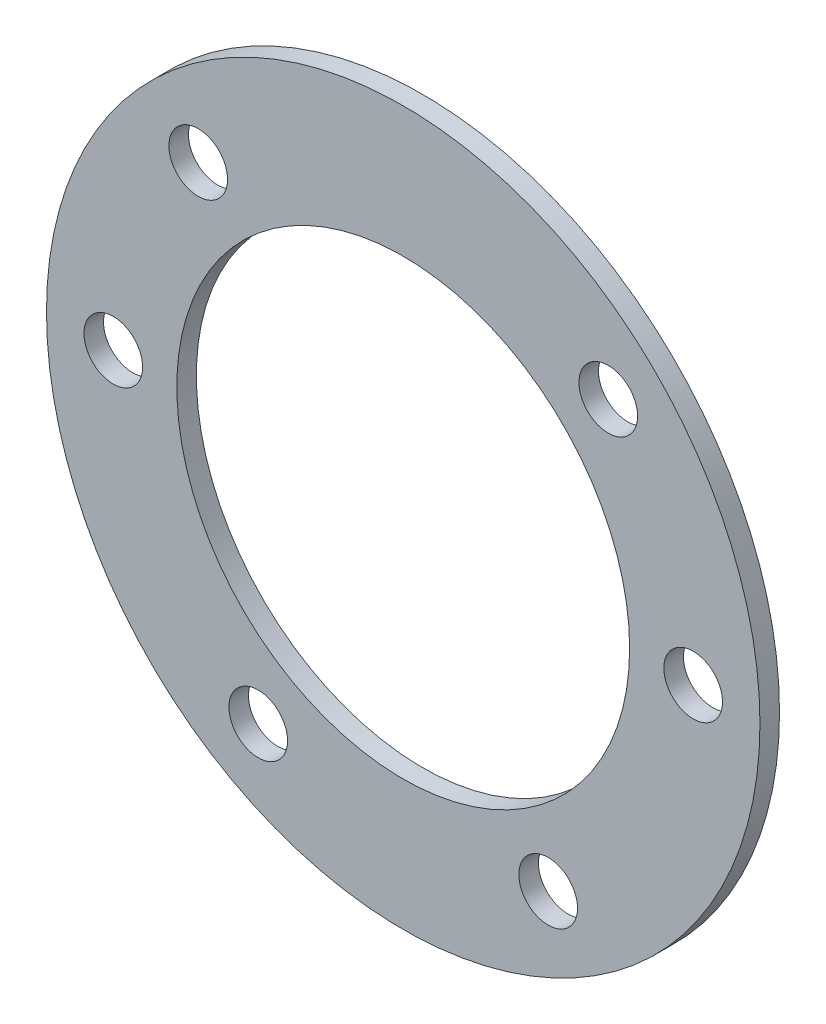
ISO-10303-21;
HEADER;
FILE_DESCRIPTION(('STEP AP214'),'2;1');
FILE_NAME('part.step','',(''),(''),'','','');
FILE_SCHEMA(('AUTOMOTIVE_DESIGN { 1 0 10303 214 1 1 1 1 }'));
ENDSEC;
DATA;
#1=APPLICATION_CONTEXT('core data for automotive mechanical design processes');
#2=APPLICATION_PROTOCOL_DEFINITION('international standard','automotive_design',2000,#1);
#3=PRODUCT_CONTEXT('',#1,'mechanical');
#4=PRODUCT('Part','Part','',(#3));
#5=PRODUCT_RELATED_PRODUCT_CATEGORY('part','',(#4));
#6=PRODUCT_DEFINITION_FORMATION('','',#4);
#7=PRODUCT_DEFINITION_CONTEXT('part definition',#1,'design');
#8=PRODUCT_DEFINITION('design','',#6,#7);
#9=PRODUCT_DEFINITION_SHAPE('','',#8);
#10=(LENGTH_UNIT() NAMED_UNIT(*) SI_UNIT(.MILLI.,.METRE.));
#11=(NAMED_UNIT(*) PLANE_ANGLE_UNIT() SI_UNIT($,.RADIAN.));
#12=(NAMED_UNIT(*) SI_UNIT($,.STERADIAN.) SOLID_ANGLE_UNIT());
#13=UNCERTAINTY_MEASURE_WITH_UNIT(LENGTH_MEASURE(1.E-05),#10,'distance_accuracy_value','');
#14=(GEOMETRIC_REPRESENTATION_CONTEXT(3) GLOBAL_UNCERTAINTY_ASSIGNED_CONTEXT((#13)) GLOBAL_UNIT_ASSIGNED_CONTEXT((#10,
#11,#12)) REPRESENTATION_CONTEXT('',''));
#15=CARTESIAN_POINT('',(0.,0.,0.));
#16=DIRECTION('',(0.,0.,1.));
#17=DIRECTION('',(1.,0.,0.));
#18=AXIS2_PLACEMENT_3D('',#15,#16,#17);
#19=CARTESIAN_POINT('',(0.,0.,6.));
#20=DIRECTION('',(0.,0.,1.));
#21=DIRECTION('',(1.,0.,0.));
#22=AXIS2_PLACEMENT_3D('',#19,#20,#21);
#23=PLANE('',#22);
#24=CARTESIAN_POINT('',(-89.,0.,6.));
#25=DIRECTION('',(0.,0.,1.));
#26=DIRECTION('',(1.,0.,0.));
#27=AXIS2_PLACEMENT_3D('',#24,#25,#26);
#28=CIRCLE('',#27,9.);
#29=CARTESIAN_POINT('',(-80.,0.,6.));
#30=VERTEX_POINT('',#29);
#31=EDGE_CURVE('E81',#30,#30,#28,.T.);
#32=ORIENTED_EDGE('',*,*,#31,.F.);
#33=EDGE_LOOP('',(#32));
#34=FACE_BOUND('',#33,.T.);
#35=CARTESIAN_POINT('',(89.,0.,6.));
#36=DIRECTION('',(0.,0.,1.));
#37=DIRECTION('',(1.,0.,0.));
#38=AXIS2_PLACEMENT_3D('',#35,#36,#37);
#39=CIRCLE('',#38,9.);
#40=CARTESIAN_POINT('',(98.,0.,6.));
#41=VERTEX_POINT('',#40);
#42=EDGE_CURVE('E69',#41,#41,#39,.T.);
#43=ORIENTED_EDGE('',*,*,#42,.F.);
#44=EDGE_LOOP('',(#43));
#45=FACE_BOUND('',#44,.T.);
#46=CARTESIAN_POINT('',(-44.5000000000004,-77.0762609368148,6.));
#47=DIRECTION('',(0.,0.,1.));
#48=DIRECTION('',(1.,0.,0.));
#49=AXIS2_PLACEMENT_3D('',#46,#47,#48);
#50=CIRCLE('',#49,9.00000000000001);
#51=CARTESIAN_POINT('',(-35.5000000000004,-77.0762609368148,6.));
#52=VERTEX_POINT('',#51);
#53=EDGE_CURVE('E57',#52,#52,#50,.T.);
#54=ORIENTED_EDGE('',*,*,#53,.F.);
#55=EDGE_LOOP('',(#54));
#56=FACE_BOUND('',#55,.T.);
#57=CARTESIAN_POINT('',(0.,0.,6.));
#58=DIRECTION('',(0.,0.,1.));
#59=DIRECTION('',(1.,0.,0.));
#60=AXIS2_PLACEMENT_3D('',#57,#58,#59);
#61=CIRCLE('',#60,109.5);
#62=CARTESIAN_POINT('',(109.5,0.,6.));
#63=VERTEX_POINT('',#62);
#64=EDGE_CURVE('E10',#63,#63,#61,.T.);
#65=ORIENTED_EDGE('',*,*,#64,.T.);
#66=EDGE_LOOP('',(#65));
#67=FACE_BOUND('',#66,.T.);
#68=CARTESIAN_POINT('',(0.,0.,6.));
#69=DIRECTION('',(0.,0.,1.));
#70=DIRECTION('',(1.,0.,0.));
#71=AXIS2_PLACEMENT_3D('',#68,#69,#70);
#72=CIRCLE('',#71,69.5);
#73=CARTESIAN_POINT('',(69.5,0.,6.));
#74=VERTEX_POINT('',#73);
#75=EDGE_CURVE('E52',#74,#74,#72,.T.);
#76=ORIENTED_EDGE('',*,*,#75,.F.);
#77=EDGE_LOOP('',(#76));
#78=FACE_BOUND('',#77,.T.);
#79=CARTESIAN_POINT('',(62.9325035256027,62.9325035256027,6.));
#80=DIRECTION('',(0.,0.,1.));
#81=DIRECTION('',(1.,0.,0.));
#82=AXIS2_PLACEMENT_3D('',#79,#80,#81);
#83=CIRCLE('',#82,8.99999999999999);
#84=CARTESIAN_POINT('',(71.9325035256027,62.9325035256027,6.));
#85=VERTEX_POINT('',#84);
#86=EDGE_CURVE('E63',#85,#85,#83,.T.);
#87=ORIENTED_EDGE('',*,*,#86,.F.);
#88=EDGE_LOOP('',(#87));
#89=FACE_BOUND('',#88,.T.);
#90=CARTESIAN_POINT('',(44.4999999999998,-77.0762609368151,6.));
#91=DIRECTION('',(0.,0.,1.));
#92=DIRECTION('',(1.,0.,0.));
#93=AXIS2_PLACEMENT_3D('',#90,#91,#92);
#94=CIRCLE('',#93,9.00000000000001);
#95=CARTESIAN_POINT('',(53.4999999999998,-77.0762609368151,6.));
#96=VERTEX_POINT('',#95);
#97=EDGE_CURVE('E75',#96,#96,#94,.T.);
#98=ORIENTED_EDGE('',*,*,#97,.F.);
#99=EDGE_LOOP('',(#98));
#100=FACE_BOUND('',#99,.T.);
#101=CARTESIAN_POINT('',(-62.9325035256027,62.9325035256027,6.));
#102=DIRECTION('',(0.,0.,1.));
#103=DIRECTION('',(1.,0.,0.));
#104=AXIS2_PLACEMENT_3D('',#101,#102,#103);
#105=CIRCLE('',#104,9.00000000000001);
#106=CARTESIAN_POINT('',(-53.9325035256027,62.9325035256027,6.));
#107=VERTEX_POINT('',#106);
#108=EDGE_CURVE('E87',#107,#107,#105,.T.);
#109=ORIENTED_EDGE('',*,*,#108,.F.);
#110=EDGE_LOOP('',(#109));
#111=FACE_BOUND('',#110,.T.);
#112=ADVANCED_FACE('F41',(#34,#45,#56,#67,#78,#89,#100,#111),#23,.T.);
#113=CARTESIAN_POINT('',(0.,0.,0.));
#114=DIRECTION('',(0.,0.,1.));
#115=DIRECTION('',(1.,0.,0.));
#116=AXIS2_PLACEMENT_3D('',#113,#114,#115);
#117=PLANE('',#116);
#118=CARTESIAN_POINT('',(0.,0.,0.));
#119=DIRECTION('',(0.,0.,1.));
#120=DIRECTION('',(1.,0.,0.));
#121=AXIS2_PLACEMENT_3D('',#118,#119,#120);
#122=CIRCLE('',#121,109.5);
#123=CARTESIAN_POINT('',(109.5,0.,0.));
#124=VERTEX_POINT('',#123);
#125=EDGE_CURVE('E45',#124,#124,#122,.T.);
#126=ORIENTED_EDGE('',*,*,#125,.F.);
#127=EDGE_LOOP('',(#126));
#128=FACE_BOUND('',#127,.T.);
#129=CARTESIAN_POINT('',(0.,0.,0.));
#130=DIRECTION('',(0.,0.,1.));
#131=DIRECTION('',(1.,0.,0.));
#132=AXIS2_PLACEMENT_3D('',#129,#130,#131);
#133=CIRCLE('',#132,69.5);
#134=CARTESIAN_POINT('',(69.5,0.,0.));
#135=VERTEX_POINT('',#134);
#136=EDGE_CURVE('E54',#135,#135,#133,.T.);
#137=ORIENTED_EDGE('',*,*,#136,.T.);
#138=EDGE_LOOP('',(#137));
#139=FACE_BOUND('',#138,.T.);
#140=CARTESIAN_POINT('',(-44.5000000000004,-77.0762609368148,0.));
#141=DIRECTION('',(0.,0.,1.));
#142=DIRECTION('',(1.,0.,0.));
#143=AXIS2_PLACEMENT_3D('',#140,#141,#142);
#144=CIRCLE('',#143,9.00000000000001);
#145=CARTESIAN_POINT('',(-35.5000000000004,-77.0762609368148,0.));
#146=VERTEX_POINT('',#145);
#147=EDGE_CURVE('E60',#146,#146,#144,.T.);
#148=ORIENTED_EDGE('',*,*,#147,.T.);
#149=EDGE_LOOP('',(#148));
#150=FACE_BOUND('',#149,.T.);
#151=CARTESIAN_POINT('',(62.9325035256027,62.9325035256027,0.));
#152=DIRECTION('',(0.,0.,1.));
#153=DIRECTION('',(1.,0.,0.));
#154=AXIS2_PLACEMENT_3D('',#151,#152,#153);
#155=CIRCLE('',#154,8.99999999999999);
#156=CARTESIAN_POINT('',(71.9325035256027,62.9325035256027,0.));
#157=VERTEX_POINT('',#156);
#158=EDGE_CURVE('E66',#157,#157,#155,.T.);
#159=ORIENTED_EDGE('',*,*,#158,.T.);
#160=EDGE_LOOP('',(#159));
#161=FACE_BOUND('',#160,.T.);
#162=CARTESIAN_POINT('',(89.,0.,0.));
#163=DIRECTION('',(0.,0.,1.));
#164=DIRECTION('',(1.,0.,0.));
#165=AXIS2_PLACEMENT_3D('',#162,#163,#164);
#166=CIRCLE('',#165,9.);
#167=CARTESIAN_POINT('',(98.,0.,0.));
#168=VERTEX_POINT('',#167);
#169=EDGE_CURVE('E72',#168,#168,#166,.T.);
#170=ORIENTED_EDGE('',*,*,#169,.T.);
#171=EDGE_LOOP('',(#170));
#172=FACE_BOUND('',#171,.T.);
#173=CARTESIAN_POINT('',(44.4999999999998,-77.0762609368151,0.));
#174=DIRECTION('',(0.,0.,1.));
#175=DIRECTION('',(1.,0.,0.));
#176=AXIS2_PLACEMENT_3D('',#173,#174,#175);
#177=CIRCLE('',#176,9.00000000000001);
#178=CARTESIAN_POINT('',(53.4999999999998,-77.0762609368151,0.));
#179=VERTEX_POINT('',#178);
#180=EDGE_CURVE('E78',#179,#179,#177,.T.);
#181=ORIENTED_EDGE('',*,*,#180,.T.);
#182=EDGE_LOOP('',(#181));
#183=FACE_BOUND('',#182,.T.);
#184=CARTESIAN_POINT('',(-89.,0.,0.));
#185=DIRECTION('',(0.,0.,1.));
#186=DIRECTION('',(1.,0.,0.));
#187=AXIS2_PLACEMENT_3D('',#184,#185,#186);
#188=CIRCLE('',#187,9.);
#189=CARTESIAN_POINT('',(-80.,0.,0.));
#190=VERTEX_POINT('',#189);
#191=EDGE_CURVE('E84',#190,#190,#188,.T.);
#192=ORIENTED_EDGE('',*,*,#191,.T.);
#193=EDGE_LOOP('',(#192));
#194=FACE_BOUND('',#193,.T.);
#195=CARTESIAN_POINT('',(-62.9325035256027,62.9325035256027,0.));
#196=DIRECTION('',(0.,0.,1.));
#197=DIRECTION('',(1.,0.,0.));
#198=AXIS2_PLACEMENT_3D('',#195,#196,#197);
#199=CIRCLE('',#198,9.00000000000001);
#200=CARTESIAN_POINT('',(-53.9325035256027,62.9325035256027,0.));
#201=VERTEX_POINT('',#200);
#202=EDGE_CURVE('E90',#201,#201,#199,.T.);
#203=ORIENTED_EDGE('',*,*,#202,.T.);
#204=EDGE_LOOP('',(#203));
#205=FACE_BOUND('',#204,.T.);
#206=ADVANCED_FACE('F100',(#128,#139,#150,#161,#172,#183,#194,#205),#117,.F.);
#207=CARTESIAN_POINT('',(0.,0.,6.));
#208=DIRECTION('',(0.,0.,-1.));
#209=DIRECTION('',(-1.,0.,0.));
#210=AXIS2_PLACEMENT_3D('',#207,#208,#209);
#211=CYLINDRICAL_SURFACE('',#210,109.5);
#212=ORIENTED_EDGE('',*,*,#64,.F.);
#213=EDGE_LOOP('',(#212));
#214=FACE_BOUND('',#213,.T.);
#215=ORIENTED_EDGE('',*,*,#125,.T.);
#216=EDGE_LOOP('',(#215));
#217=FACE_BOUND('',#216,.T.);
#218=ADVANCED_FACE('F43',(#214,#217),#211,.T.);
#219=CARTESIAN_POINT('',(0.,0.,6.));
#220=DIRECTION('',(0.,0.,-1.));
#221=DIRECTION('',(-1.,0.,0.));
#222=AXIS2_PLACEMENT_3D('',#219,#220,#221);
#223=CYLINDRICAL_SURFACE('',#222,69.5);
#224=ORIENTED_EDGE('',*,*,#75,.T.);
#225=EDGE_LOOP('',(#224));
#226=FACE_BOUND('',#225,.T.);
#227=ORIENTED_EDGE('',*,*,#136,.F.);
#228=EDGE_LOOP('',(#227));
#229=FACE_BOUND('',#228,.T.);
#230=ADVANCED_FACE('F110',(#226,#229),#223,.F.);
#231=CARTESIAN_POINT('',(-44.5000000000004,-77.0762609368148,6.));
#232=DIRECTION('',(0.,0.,-1.));
#233=DIRECTION('',(-1.,0.,0.));
#234=AXIS2_PLACEMENT_3D('',#231,#232,#233);
#235=CYLINDRICAL_SURFACE('',#234,9.00000000000001);
#236=ORIENTED_EDGE('',*,*,#53,.T.);
#237=EDGE_LOOP('',(#236));
#238=FACE_BOUND('',#237,.T.);
#239=ORIENTED_EDGE('',*,*,#147,.F.);
#240=EDGE_LOOP('',(#239));
#241=FACE_BOUND('',#240,.T.);
#242=ADVANCED_FACE('F113',(#238,#241),#235,.F.);
#243=CARTESIAN_POINT('',(62.9325035256027,62.9325035256027,6.));
#244=DIRECTION('',(0.,0.,-1.));
#245=DIRECTION('',(-1.,0.,0.));
#246=AXIS2_PLACEMENT_3D('',#243,#244,#245);
#247=CYLINDRICAL_SURFACE('',#246,8.99999999999999);
#248=ORIENTED_EDGE('',*,*,#86,.T.);
#249=EDGE_LOOP('',(#248));
#250=FACE_BOUND('',#249,.T.);
#251=ORIENTED_EDGE('',*,*,#158,.F.);
#252=EDGE_LOOP('',(#251));
#253=FACE_BOUND('',#252,.T.);
#254=ADVANCED_FACE('F117',(#250,#253),#247,.F.);
#255=CARTESIAN_POINT('',(89.,0.,6.));
#256=DIRECTION('',(0.,0.,-1.));
#257=DIRECTION('',(-1.,0.,0.));
#258=AXIS2_PLACEMENT_3D('',#255,#256,#257);
#259=CYLINDRICAL_SURFACE('',#258,9.);
#260=ORIENTED_EDGE('',*,*,#42,.T.);
#261=EDGE_LOOP('',(#260));
#262=FACE_BOUND('',#261,.T.);
#263=ORIENTED_EDGE('',*,*,#169,.F.);
#264=EDGE_LOOP('',(#263));
#265=FACE_BOUND('',#264,.T.);
#266=ADVANCED_FACE('F121',(#262,#265),#259,.F.);
#267=CARTESIAN_POINT('',(44.4999999999998,-77.0762609368151,6.));
#268=DIRECTION('',(0.,0.,-1.));
#269=DIRECTION('',(-1.,0.,0.));
#270=AXIS2_PLACEMENT_3D('',#267,#268,#269);
#271=CYLINDRICAL_SURFACE('',#270,9.00000000000001);
#272=ORIENTED_EDGE('',*,*,#97,.T.);
#273=EDGE_LOOP('',(#272));
#274=FACE_BOUND('',#273,.T.);
#275=ORIENTED_EDGE('',*,*,#180,.F.);
#276=EDGE_LOOP('',(#275));
#277=FACE_BOUND('',#276,.T.);
#278=ADVANCED_FACE('F125',(#274,#277),#271,.F.);
#279=CARTESIAN_POINT('',(-89.,0.,6.));
#280=DIRECTION('',(0.,0.,-1.));
#281=DIRECTION('',(-1.,0.,0.));
#282=AXIS2_PLACEMENT_3D('',#279,#280,#281);
#283=CYLINDRICAL_SURFACE('',#282,9.);
#284=ORIENTED_EDGE('',*,*,#31,.T.);
#285=EDGE_LOOP('',(#284));
#286=FACE_BOUND('',#285,.T.);
#287=ORIENTED_EDGE('',*,*,#191,.F.);
#288=EDGE_LOOP('',(#287));
#289=FACE_BOUND('',#288,.T.);
#290=ADVANCED_FACE('F129',(#286,#289),#283,.F.);
#291=CARTESIAN_POINT('',(-62.9325035256027,62.9325035256027,6.));
#292=DIRECTION('',(0.,0.,-1.));
#293=DIRECTION('',(-1.,0.,0.));
#294=AXIS2_PLACEMENT_3D('',#291,#292,#293);
#295=CYLINDRICAL_SURFACE('',#294,9.00000000000001);
#296=ORIENTED_EDGE('',*,*,#108,.T.);
#297=EDGE_LOOP('',(#296));
#298=FACE_BOUND('',#297,.T.);
#299=ORIENTED_EDGE('',*,*,#202,.F.);
#300=EDGE_LOOP('',(#299));
#301=FACE_BOUND('',#300,.T.);
#302=ADVANCED_FACE('F96',(#298,#301),#295,.F.);
#303=CLOSED_SHELL('',(#112,#206,#218,#230,#242,#254,#266,#278,#290,#302));
#304=MANIFOLD_SOLID_BREP('B2',#303);
#305=ADVANCED_BREP_SHAPE_REPRESENTATION('',(#18,#304),#14);
#306=SHAPE_DEFINITION_REPRESENTATION(#9,#305);
ENDSEC;
END-ISO-10303-21;
